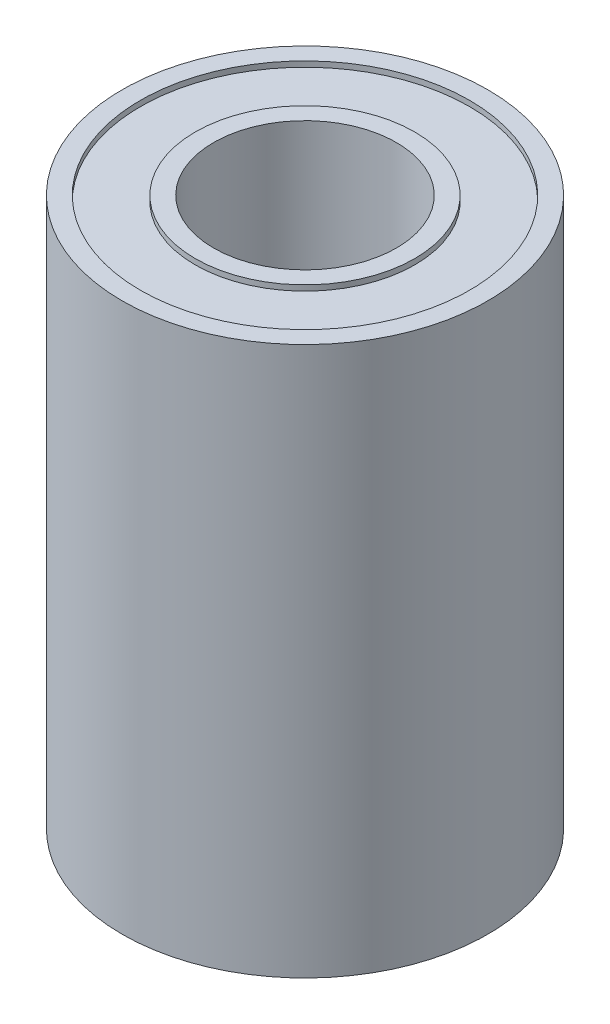
ISO-10303-21;
HEADER;
FILE_DESCRIPTION(('STEP AP214'),'2;1');
FILE_NAME('part.step','',(''),(''),'','','');
FILE_SCHEMA(('AUTOMOTIVE_DESIGN { 1 0 10303 214 1 1 1 1 }'));
ENDSEC;
DATA;
#1=APPLICATION_CONTEXT('core data for automotive mechanical design processes');
#2=APPLICATION_PROTOCOL_DEFINITION('international standard','automotive_design',2000,#1);
#3=PRODUCT_CONTEXT('',#1,'mechanical');
#4=PRODUCT('Part','Part','',(#3));
#5=PRODUCT_RELATED_PRODUCT_CATEGORY('part','',(#4));
#6=PRODUCT_DEFINITION_FORMATION('','',#4);
#7=PRODUCT_DEFINITION_CONTEXT('part definition',#1,'design');
#8=PRODUCT_DEFINITION('design','',#6,#7);
#9=PRODUCT_DEFINITION_SHAPE('','',#8);
#10=(LENGTH_UNIT() NAMED_UNIT(*) SI_UNIT(.MILLI.,.METRE.));
#11=(NAMED_UNIT(*) PLANE_ANGLE_UNIT() SI_UNIT($,.RADIAN.));
#12=(NAMED_UNIT(*) SI_UNIT($,.STERADIAN.) SOLID_ANGLE_UNIT());
#13=UNCERTAINTY_MEASURE_WITH_UNIT(LENGTH_MEASURE(1.E-05),#10,'distance_accuracy_value','');
#14=(GEOMETRIC_REPRESENTATION_CONTEXT(3) GLOBAL_UNCERTAINTY_ASSIGNED_CONTEXT((#13)) GLOBAL_UNIT_ASSIGNED_CONTEXT((#10,
#11,#12)) REPRESENTATION_CONTEXT('',''));
#15=CARTESIAN_POINT('',(0.,0.,0.));
#16=DIRECTION('',(0.,0.,1.));
#17=DIRECTION('',(1.,0.,0.));
#18=AXIS2_PLACEMENT_3D('',#15,#16,#17);
#19=CARTESIAN_POINT('',(0.,7.5,0.));
#20=DIRECTION('',(0.,1.,0.));
#21=DIRECTION('',(0.,0.,1.));
#22=AXIS2_PLACEMENT_3D('',#19,#20,#21);
#23=PLANE('',#22);
#24=CARTESIAN_POINT('',(0.,7.5,0.));
#25=DIRECTION('',(0.,1.,0.));
#26=DIRECTION('',(0.,0.,1.));
#27=AXIS2_PLACEMENT_3D('',#24,#25,#26);
#28=CIRCLE('',#27,2.5);
#29=CARTESIAN_POINT('',(0.,7.5,2.5));
#30=VERTEX_POINT('',#29);
#31=EDGE_CURVE('E45',#30,#30,#28,.T.);
#32=ORIENTED_EDGE('',*,*,#31,.F.);
#33=EDGE_LOOP('',(#32));
#34=FACE_BOUND('',#33,.T.);
#35=CARTESIAN_POINT('',(0.,7.5,0.));
#36=DIRECTION('',(0.,1.,0.));
#37=DIRECTION('',(0.,0.,1.));
#38=AXIS2_PLACEMENT_3D('',#35,#36,#37);
#39=CIRCLE('',#38,3.);
#40=CARTESIAN_POINT('',(0.,7.5,3.));
#41=VERTEX_POINT('',#40);
#42=EDGE_CURVE('E62',#41,#41,#39,.T.);
#43=ORIENTED_EDGE('',*,*,#42,.T.);
#44=EDGE_LOOP('',(#43));
#45=FACE_BOUND('',#44,.T.);
#46=ADVANCED_FACE('F37',(#34,#45),#23,.T.);
#47=CARTESIAN_POINT('',(0.,7.5,0.));
#48=DIRECTION('',(0.,1.,0.));
#49=DIRECTION('',(0.,0.,1.));
#50=AXIS2_PLACEMENT_3D('',#47,#48,#49);
#51=CIRCLE('',#50,4.5);
#52=CARTESIAN_POINT('',(0.,7.5,4.5));
#53=VERTEX_POINT('',#52);
#54=EDGE_CURVE('E55',#53,#53,#51,.T.);
#55=ORIENTED_EDGE('',*,*,#54,.F.);
#56=EDGE_LOOP('',(#55));
#57=FACE_BOUND('',#56,.T.);
#58=CARTESIAN_POINT('',(0.,7.5,0.));
#59=DIRECTION('',(0.,1.,0.));
#60=DIRECTION('',(0.,0.,1.));
#61=AXIS2_PLACEMENT_3D('',#58,#59,#60);
#62=CIRCLE('',#61,5.);
#63=CARTESIAN_POINT('',(0.,7.5,5.));
#64=VERTEX_POINT('',#63);
#65=EDGE_CURVE('E10',#64,#64,#62,.T.);
#66=ORIENTED_EDGE('',*,*,#65,.T.);
#67=EDGE_LOOP('',(#66));
#68=FACE_BOUND('',#67,.T.);
#69=ADVANCED_FACE('F120',(#57,#68),#23,.T.);
#70=CARTESIAN_POINT('',(0.,7.5,0.));
#71=DIRECTION('',(0.,-1.,0.));
#72=DIRECTION('',(0.,0.,-1.));
#73=AXIS2_PLACEMENT_3D('',#70,#71,#72);
#74=CYLINDRICAL_SURFACE('',#73,5.);
#75=ORIENTED_EDGE('',*,*,#65,.F.);
#76=EDGE_LOOP('',(#75));
#77=FACE_BOUND('',#76,.T.);
#78=CARTESIAN_POINT('',(0.,-7.5,0.));
#79=DIRECTION('',(0.,1.,0.));
#80=DIRECTION('',(0.,0.,1.));
#81=AXIS2_PLACEMENT_3D('',#78,#79,#80);
#82=CIRCLE('',#81,5.);
#83=CARTESIAN_POINT('',(0.,-7.5,5.));
#84=VERTEX_POINT('',#83);
#85=EDGE_CURVE('E66',#84,#84,#82,.T.);
#86=ORIENTED_EDGE('',*,*,#85,.T.);
#87=EDGE_LOOP('',(#86));
#88=FACE_BOUND('',#87,.T.);
#89=ADVANCED_FACE('F39',(#77,#88),#74,.T.);
#90=CARTESIAN_POINT('',(0.,7.5,0.));
#91=DIRECTION('',(0.,-1.,0.));
#92=DIRECTION('',(0.,0.,-1.));
#93=AXIS2_PLACEMENT_3D('',#90,#91,#92);
#94=CYLINDRICAL_SURFACE('',#93,2.5);
#95=ORIENTED_EDGE('',*,*,#31,.T.);
#96=EDGE_LOOP('',(#95));
#97=FACE_BOUND('',#96,.T.);
#98=CARTESIAN_POINT('',(0.,-7.5,0.));
#99=DIRECTION('',(0.,1.,0.));
#100=DIRECTION('',(0.,0.,1.));
#101=AXIS2_PLACEMENT_3D('',#98,#99,#100);
#102=CIRCLE('',#101,2.5);
#103=CARTESIAN_POINT('',(0.,-7.5,2.5));
#104=VERTEX_POINT('',#103);
#105=EDGE_CURVE('E73',#104,#104,#102,.T.);
#106=ORIENTED_EDGE('',*,*,#105,.F.);
#107=EDGE_LOOP('',(#106));
#108=FACE_BOUND('',#107,.T.);
#109=ADVANCED_FACE('F128',(#97,#108),#94,.F.);
#110=CARTESIAN_POINT('',(0.,7.35,0.));
#111=DIRECTION('',(0.,1.,0.));
#112=DIRECTION('',(0.,0.,1.));
#113=AXIS2_PLACEMENT_3D('',#110,#111,#112);
#114=CYLINDRICAL_SURFACE('',#113,4.5);
#115=CARTESIAN_POINT('',(0.,7.35,0.));
#116=DIRECTION('',(0.,1.,0.));
#117=DIRECTION('',(0.,0.,1.));
#118=AXIS2_PLACEMENT_3D('',#115,#116,#117);
#119=CIRCLE('',#118,4.5);
#120=CARTESIAN_POINT('',(0.,7.35,4.5));
#121=VERTEX_POINT('',#120);
#122=EDGE_CURVE('E50',#121,#121,#119,.T.);
#123=ORIENTED_EDGE('',*,*,#122,.F.);
#124=EDGE_LOOP('',(#123));
#125=FACE_BOUND('',#124,.T.);
#126=ORIENTED_EDGE('',*,*,#54,.T.);
#127=EDGE_LOOP('',(#126));
#128=FACE_BOUND('',#127,.T.);
#129=ADVANCED_FACE('F131',(#125,#128),#114,.F.);
#130=CARTESIAN_POINT('',(0.,7.35,0.));
#131=DIRECTION('',(0.,1.,0.));
#132=DIRECTION('',(0.,0.,1.));
#133=AXIS2_PLACEMENT_3D('',#130,#131,#132);
#134=PLANE('',#133);
#135=CARTESIAN_POINT('',(0.,7.35,0.));
#136=DIRECTION('',(0.,1.,0.));
#137=DIRECTION('',(0.,0.,1.));
#138=AXIS2_PLACEMENT_3D('',#135,#136,#137);
#139=CIRCLE('',#138,3.);
#140=CARTESIAN_POINT('',(0.,7.35,3.));
#141=VERTEX_POINT('',#140);
#142=EDGE_CURVE('E60',#141,#141,#139,.T.);
#143=ORIENTED_EDGE('',*,*,#142,.F.);
#144=EDGE_LOOP('',(#143));
#145=FACE_BOUND('',#144,.T.);
#146=ORIENTED_EDGE('',*,*,#122,.T.);
#147=EDGE_LOOP('',(#146));
#148=FACE_BOUND('',#147,.T.);
#149=ADVANCED_FACE('F115',(#145,#148),#134,.T.);
#150=CARTESIAN_POINT('',(0.,7.35,0.));
#151=DIRECTION('',(0.,1.,0.));
#152=DIRECTION('',(0.,0.,1.));
#153=AXIS2_PLACEMENT_3D('',#150,#151,#152);
#154=CYLINDRICAL_SURFACE('',#153,3.);
#155=ORIENTED_EDGE('',*,*,#142,.T.);
#156=EDGE_LOOP('',(#155));
#157=FACE_BOUND('',#156,.T.);
#158=ORIENTED_EDGE('',*,*,#42,.F.);
#159=EDGE_LOOP('',(#158));
#160=FACE_BOUND('',#159,.T.);
#161=ADVANCED_FACE('F106',(#157,#160),#154,.T.);
#162=CARTESIAN_POINT('',(0.,-7.5,0.));
#163=DIRECTION('',(0.,-1.,0.));
#164=DIRECTION('',(0.,0.,1.));
#165=AXIS2_PLACEMENT_3D('',#162,#163,#164);
#166=PLANE('',#165);
#167=ORIENTED_EDGE('',*,*,#105,.T.);
#168=EDGE_LOOP('',(#167));
#169=FACE_BOUND('',#168,.T.);
#170=CARTESIAN_POINT('',(0.,-7.5,0.));
#171=DIRECTION('',(0.,1.,0.));
#172=DIRECTION('',(0.,0.,1.));
#173=AXIS2_PLACEMENT_3D('',#170,#171,#172);
#174=CIRCLE('',#173,3.);
#175=CARTESIAN_POINT('',(0.,-7.5,3.));
#176=VERTEX_POINT('',#175);
#177=EDGE_CURVE('E86',#176,#176,#174,.T.);
#178=ORIENTED_EDGE('',*,*,#177,.F.);
#179=EDGE_LOOP('',(#178));
#180=FACE_BOUND('',#179,.T.);
#181=ADVANCED_FACE('F103',(#169,#180),#166,.T.);
#182=CARTESIAN_POINT('',(0.,-7.5,0.));
#183=DIRECTION('',(0.,1.,0.));
#184=DIRECTION('',(0.,0.,1.));
#185=AXIS2_PLACEMENT_3D('',#182,#183,#184);
#186=CIRCLE('',#185,4.5);
#187=CARTESIAN_POINT('',(0.,-7.5,4.5));
#188=VERTEX_POINT('',#187);
#189=EDGE_CURVE('E78',#188,#188,#186,.T.);
#190=ORIENTED_EDGE('',*,*,#189,.T.);
#191=EDGE_LOOP('',(#190));
#192=FACE_BOUND('',#191,.T.);
#193=ORIENTED_EDGE('',*,*,#85,.F.);
#194=EDGE_LOOP('',(#193));
#195=FACE_BOUND('',#194,.T.);
#196=ADVANCED_FACE('F105',(#192,#195),#166,.T.);
#197=CARTESIAN_POINT('',(0.,-7.35,0.));
#198=DIRECTION('',(0.,-1.,0.));
#199=DIRECTION('',(0.,0.,1.));
#200=AXIS2_PLACEMENT_3D('',#197,#198,#199);
#201=CYLINDRICAL_SURFACE('',#200,4.5);
#202=CARTESIAN_POINT('',(0.,-7.35,0.));
#203=DIRECTION('',(0.,1.,0.));
#204=DIRECTION('',(0.,0.,1.));
#205=AXIS2_PLACEMENT_3D('',#202,#203,#204);
#206=CIRCLE('',#205,4.5);
#207=CARTESIAN_POINT('',(0.,-7.35,4.5));
#208=VERTEX_POINT('',#207);
#209=EDGE_CURVE('E77',#208,#208,#206,.T.);
#210=ORIENTED_EDGE('',*,*,#209,.T.);
#211=EDGE_LOOP('',(#210));
#212=FACE_BOUND('',#211,.T.);
#213=ORIENTED_EDGE('',*,*,#189,.F.);
#214=EDGE_LOOP('',(#213));
#215=FACE_BOUND('',#214,.T.);
#216=ADVANCED_FACE('F113',(#212,#215),#201,.F.);
#217=CARTESIAN_POINT('',(0.,-7.35,0.));
#218=DIRECTION('',(0.,-1.,0.));
#219=DIRECTION('',(0.,0.,1.));
#220=AXIS2_PLACEMENT_3D('',#217,#218,#219);
#221=PLANE('',#220);
#222=CARTESIAN_POINT('',(0.,-7.35,0.));
#223=DIRECTION('',(0.,1.,0.));
#224=DIRECTION('',(0.,0.,1.));
#225=AXIS2_PLACEMENT_3D('',#222,#223,#224);
#226=CIRCLE('',#225,3.);
#227=CARTESIAN_POINT('',(0.,-7.35,3.));
#228=VERTEX_POINT('',#227);
#229=EDGE_CURVE('E82',#228,#228,#226,.T.);
#230=ORIENTED_EDGE('',*,*,#229,.T.);
#231=EDGE_LOOP('',(#230));
#232=FACE_BOUND('',#231,.T.);
#233=ORIENTED_EDGE('',*,*,#209,.F.);
#234=EDGE_LOOP('',(#233));
#235=FACE_BOUND('',#234,.T.);
#236=ADVANCED_FACE('F94',(#232,#235),#221,.T.);
#237=CARTESIAN_POINT('',(0.,-7.35,0.));
#238=DIRECTION('',(0.,-1.,0.));
#239=DIRECTION('',(0.,0.,1.));
#240=AXIS2_PLACEMENT_3D('',#237,#238,#239);
#241=CYLINDRICAL_SURFACE('',#240,3.);
#242=ORIENTED_EDGE('',*,*,#229,.F.);
#243=EDGE_LOOP('',(#242));
#244=FACE_BOUND('',#243,.T.);
#245=ORIENTED_EDGE('',*,*,#177,.T.);
#246=EDGE_LOOP('',(#245));
#247=FACE_BOUND('',#246,.T.);
#248=ADVANCED_FACE('F97',(#244,#247),#241,.T.);
#249=CLOSED_SHELL('',(#46,#69,#89,#109,#129,#149,#161,#181,#196,#216,#236,#248));
#250=MANIFOLD_SOLID_BREP('B2',#249);
#251=ADVANCED_BREP_SHAPE_REPRESENTATION('',(#18,#250),#14);
#252=SHAPE_DEFINITION_REPRESENTATION(#9,#251);
ENDSEC;
END-ISO-10303-21;
